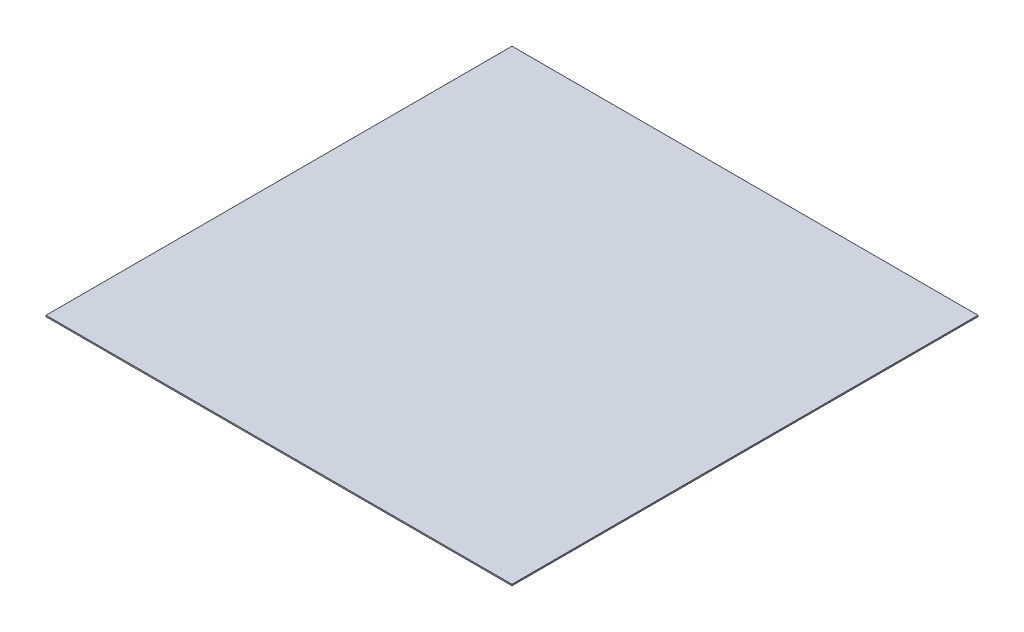
ISO-10303-21;
HEADER;
FILE_DESCRIPTION(('STEP AP214'),'2;1');
FILE_NAME('part.step','',(''),(''),'','','');
FILE_SCHEMA(('AUTOMOTIVE_DESIGN { 1 0 10303 214 1 1 1 1 }'));
ENDSEC;
DATA;
#1=APPLICATION_CONTEXT('core data for automotive mechanical design processes');
#2=APPLICATION_PROTOCOL_DEFINITION('international standard','automotive_design',2000,#1);
#3=PRODUCT_CONTEXT('',#1,'mechanical');
#4=PRODUCT('Part','Part','',(#3));
#5=PRODUCT_RELATED_PRODUCT_CATEGORY('part','',(#4));
#6=PRODUCT_DEFINITION_FORMATION('','',#4);
#7=PRODUCT_DEFINITION_CONTEXT('part definition',#1,'design');
#8=PRODUCT_DEFINITION('design','',#6,#7);
#9=PRODUCT_DEFINITION_SHAPE('','',#8);
#10=(LENGTH_UNIT() NAMED_UNIT(*) SI_UNIT(.MILLI.,.METRE.));
#11=(NAMED_UNIT(*) PLANE_ANGLE_UNIT() SI_UNIT($,.RADIAN.));
#12=(NAMED_UNIT(*) SI_UNIT($,.STERADIAN.) SOLID_ANGLE_UNIT());
#13=UNCERTAINTY_MEASURE_WITH_UNIT(LENGTH_MEASURE(1.E-05),#10,'distance_accuracy_value','');
#14=(GEOMETRIC_REPRESENTATION_CONTEXT(3) GLOBAL_UNCERTAINTY_ASSIGNED_CONTEXT((#13)) GLOBAL_UNIT_ASSIGNED_CONTEXT((#10,
#11,#12)) REPRESENTATION_CONTEXT('',''));
#15=CARTESIAN_POINT('',(0.,0.,0.));
#16=DIRECTION('',(0.,0.,1.));
#17=DIRECTION('',(1.,0.,0.));
#18=AXIS2_PLACEMENT_3D('',#15,#16,#17);
#19=CARTESIAN_POINT('',(0.,2.54,0.));
#20=DIRECTION('',(1.,0.,0.));
#21=DIRECTION('',(0.,0.,-1.));
#22=AXIS2_PLACEMENT_3D('',#19,#20,#21);
#23=PLANE('',#22);
#24=DIRECTION('',(0.,0.,1.));
#25=VECTOR('',#24,1.);
#26=CARTESIAN_POINT('',(0.,0.,0.));
#27=LINE('',#26,#25);
#28=CARTESIAN_POINT('',(-2.22044604925031E-13,0.,-914.4));
#29=VERTEX_POINT('',#28);
#30=CARTESIAN_POINT('',(0.,0.,0.));
#31=VERTEX_POINT('',#30);
#32=EDGE_CURVE('E107',#29,#31,#27,.T.);
#33=ORIENTED_EDGE('',*,*,#32,.T.);
#34=DIRECTION('',(0.,-1.,0.));
#35=VECTOR('',#34,1.);
#36=CARTESIAN_POINT('',(0.,2.54,0.));
#37=LINE('',#36,#35);
#38=CARTESIAN_POINT('',(0.,2.54,0.));
#39=VERTEX_POINT('',#38);
#40=EDGE_CURVE('E11',#39,#31,#37,.T.);
#41=ORIENTED_EDGE('',*,*,#40,.F.);
#42=DIRECTION('',(0.,0.,1.));
#43=VECTOR('',#42,1.);
#44=CARTESIAN_POINT('',(0.,2.54,0.));
#45=LINE('',#44,#43);
#46=CARTESIAN_POINT('',(-2.22044604925031E-13,2.54,-914.4));
#47=VERTEX_POINT('',#46);
#48=EDGE_CURVE('E91',#47,#39,#45,.T.);
#49=ORIENTED_EDGE('',*,*,#48,.F.);
#50=DIRECTION('',(0.,-1.,0.));
#51=VECTOR('',#50,1.);
#52=CARTESIAN_POINT('',(-2.22044604925031E-13,2.54,-914.4));
#53=LINE('',#52,#51);
#54=EDGE_CURVE('E103',#47,#29,#53,.T.);
#55=ORIENTED_EDGE('',*,*,#54,.T.);
#56=EDGE_LOOP('',(#33,#41,#49,#55));
#57=FACE_BOUND('',#56,.T.);
#58=ADVANCED_FACE('F39',(#57),#23,.F.);
#59=CARTESIAN_POINT('',(0.,2.54,0.));
#60=DIRECTION('',(0.,0.,-1.));
#61=DIRECTION('',(-1.,0.,0.));
#62=AXIS2_PLACEMENT_3D('',#59,#60,#61);
#63=PLANE('',#62);
#64=DIRECTION('',(1.,0.,0.));
#65=VECTOR('',#64,1.);
#66=CARTESIAN_POINT('',(0.,0.,0.));
#67=LINE('',#66,#65);
#68=CARTESIAN_POINT('',(914.4,0.,0.));
#69=VERTEX_POINT('',#68);
#70=EDGE_CURVE('E96',#31,#69,#67,.T.);
#71=ORIENTED_EDGE('',*,*,#70,.T.);
#72=DIRECTION('',(0.,-1.,0.));
#73=VECTOR('',#72,1.);
#74=CARTESIAN_POINT('',(914.4,2.54,0.));
#75=LINE('',#74,#73);
#76=CARTESIAN_POINT('',(914.4,2.54,0.));
#77=VERTEX_POINT('',#76);
#78=EDGE_CURVE('E48',#77,#69,#75,.T.);
#79=ORIENTED_EDGE('',*,*,#78,.F.);
#80=DIRECTION('',(1.,0.,0.));
#81=VECTOR('',#80,1.);
#82=CARTESIAN_POINT('',(0.,2.54,0.));
#83=LINE('',#82,#81);
#84=EDGE_CURVE('E86',#39,#77,#83,.T.);
#85=ORIENTED_EDGE('',*,*,#84,.F.);
#86=ORIENTED_EDGE('',*,*,#40,.T.);
#87=EDGE_LOOP('',(#71,#79,#85,#86));
#88=FACE_BOUND('',#87,.T.);
#89=ADVANCED_FACE('F95',(#88),#63,.F.);
#90=CARTESIAN_POINT('',(914.4,2.54,0.));
#91=DIRECTION('',(-1.,0.,0.));
#92=DIRECTION('',(0.,0.,1.));
#93=AXIS2_PLACEMENT_3D('',#90,#91,#92);
#94=PLANE('',#93);
#95=DIRECTION('',(0.,0.,-1.));
#96=VECTOR('',#95,1.);
#97=CARTESIAN_POINT('',(914.4,0.,0.));
#98=LINE('',#97,#96);
#99=CARTESIAN_POINT('',(914.4,0.,-914.4));
#100=VERTEX_POINT('',#99);
#101=EDGE_CURVE('E73',#69,#100,#98,.T.);
#102=ORIENTED_EDGE('',*,*,#101,.T.);
#103=DIRECTION('',(0.,-1.,0.));
#104=VECTOR('',#103,1.);
#105=CARTESIAN_POINT('',(914.4,2.54,-914.4));
#106=LINE('',#105,#104);
#107=CARTESIAN_POINT('',(914.4,2.54,-914.4));
#108=VERTEX_POINT('',#107);
#109=EDGE_CURVE('E98',#108,#100,#106,.T.);
#110=ORIENTED_EDGE('',*,*,#109,.F.);
#111=DIRECTION('',(0.,0.,-1.));
#112=VECTOR('',#111,1.);
#113=CARTESIAN_POINT('',(914.4,2.54,0.));
#114=LINE('',#113,#112);
#115=EDGE_CURVE('E89',#77,#108,#114,.T.);
#116=ORIENTED_EDGE('',*,*,#115,.F.);
#117=ORIENTED_EDGE('',*,*,#78,.T.);
#118=EDGE_LOOP('',(#102,#110,#116,#117));
#119=FACE_BOUND('',#118,.T.);
#120=ADVANCED_FACE('F99',(#119),#94,.F.);
#121=CARTESIAN_POINT('',(-2.22044604925031E-13,2.54,-914.4));
#122=DIRECTION('',(0.,0.,1.));
#123=DIRECTION('',(1.,0.,0.));
#124=AXIS2_PLACEMENT_3D('',#121,#122,#123);
#125=PLANE('',#124);
#126=DIRECTION('',(-1.,0.,0.));
#127=VECTOR('',#126,1.);
#128=CARTESIAN_POINT('',(-2.22044604925031E-13,0.,-914.4));
#129=LINE('',#128,#127);
#130=EDGE_CURVE('E79',#100,#29,#129,.T.);
#131=ORIENTED_EDGE('',*,*,#130,.T.);
#132=ORIENTED_EDGE('',*,*,#54,.F.);
#133=DIRECTION('',(-1.,0.,0.));
#134=VECTOR('',#133,1.);
#135=CARTESIAN_POINT('',(-2.22044604925031E-13,2.54,-914.4));
#136=LINE('',#135,#134);
#137=EDGE_CURVE('E56',#108,#47,#136,.T.);
#138=ORIENTED_EDGE('',*,*,#137,.F.);
#139=ORIENTED_EDGE('',*,*,#109,.T.);
#140=EDGE_LOOP('',(#131,#132,#138,#139));
#141=FACE_BOUND('',#140,.T.);
#142=ADVANCED_FACE('F120',(#141),#125,.F.);
#143=CARTESIAN_POINT('',(0.,2.54,0.));
#144=DIRECTION('',(0.,-1.,0.));
#145=DIRECTION('',(0.,0.,-1.));
#146=AXIS2_PLACEMENT_3D('',#143,#144,#145);
#147=PLANE('',#146);
#148=ORIENTED_EDGE('',*,*,#48,.T.);
#149=ORIENTED_EDGE('',*,*,#84,.T.);
#150=ORIENTED_EDGE('',*,*,#115,.T.);
#151=ORIENTED_EDGE('',*,*,#137,.T.);
#152=EDGE_LOOP('',(#148,#149,#150,#151));
#153=FACE_BOUND('',#152,.T.);
#154=ADVANCED_FACE('F87',(#153),#147,.F.);
#155=CARTESIAN_POINT('',(0.,0.,0.));
#156=DIRECTION('',(0.,-1.,0.));
#157=DIRECTION('',(0.,0.,-1.));
#158=AXIS2_PLACEMENT_3D('',#155,#156,#157);
#159=PLANE('',#158);
#160=ORIENTED_EDGE('',*,*,#32,.F.);
#161=ORIENTED_EDGE('',*,*,#130,.F.);
#162=ORIENTED_EDGE('',*,*,#101,.F.);
#163=ORIENTED_EDGE('',*,*,#70,.F.);
#164=EDGE_LOOP('',(#160,#161,#162,#163));
#165=FACE_BOUND('',#164,.T.);
#166=ADVANCED_FACE('F123',(#165),#159,.T.);
#167=CLOSED_SHELL('',(#58,#89,#120,#142,#154,#166));
#168=MANIFOLD_SOLID_BREP('B2',#167);
#169=ADVANCED_BREP_SHAPE_REPRESENTATION('',(#18,#168),#14);
#170=SHAPE_DEFINITION_REPRESENTATION(#9,#169);
ENDSEC;
END-ISO-10303-21;
